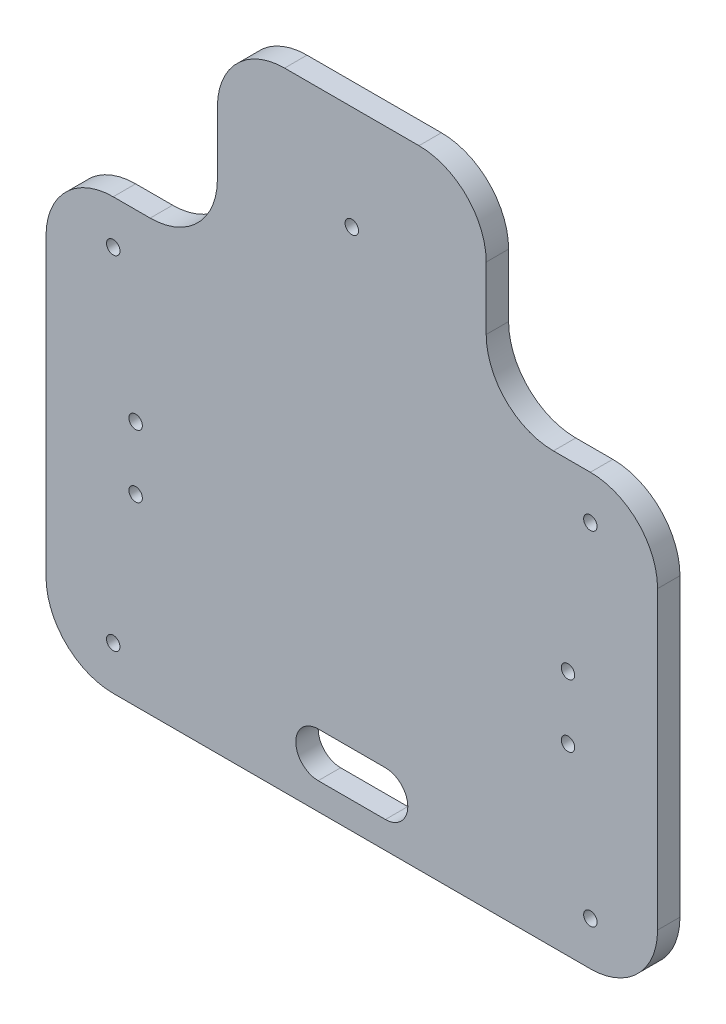
ISO-10303-21;
HEADER;
FILE_DESCRIPTION(('STEP AP214'),'2;1');
FILE_NAME('part.step','',(''),(''),'','','');
FILE_SCHEMA(('AUTOMOTIVE_DESIGN { 1 0 10303 214 1 1 1 1 }'));
ENDSEC;
DATA;
#1=APPLICATION_CONTEXT('core data for automotive mechanical design processes');
#2=APPLICATION_PROTOCOL_DEFINITION('international standard','automotive_design',2000,#1);
#3=PRODUCT_CONTEXT('',#1,'mechanical');
#4=PRODUCT('Part','Part','',(#3));
#5=PRODUCT_RELATED_PRODUCT_CATEGORY('part','',(#4));
#6=PRODUCT_DEFINITION_FORMATION('','',#4);
#7=PRODUCT_DEFINITION_CONTEXT('part definition',#1,'design');
#8=PRODUCT_DEFINITION('design','',#6,#7);
#9=PRODUCT_DEFINITION_SHAPE('','',#8);
#10=(LENGTH_UNIT() NAMED_UNIT(*) SI_UNIT(.MILLI.,.METRE.));
#11=(NAMED_UNIT(*) PLANE_ANGLE_UNIT() SI_UNIT($,.RADIAN.));
#12=(NAMED_UNIT(*) SI_UNIT($,.STERADIAN.) SOLID_ANGLE_UNIT());
#13=UNCERTAINTY_MEASURE_WITH_UNIT(LENGTH_MEASURE(1.E-05),#10,'distance_accuracy_value','');
#14=(GEOMETRIC_REPRESENTATION_CONTEXT(3) GLOBAL_UNCERTAINTY_ASSIGNED_CONTEXT((#13)) GLOBAL_UNIT_ASSIGNED_CONTEXT((#10,
#11,#12)) REPRESENTATION_CONTEXT('',''));
#15=CARTESIAN_POINT('',(0.,0.,0.));
#16=DIRECTION('',(0.,0.,1.));
#17=DIRECTION('',(1.,0.,0.));
#18=AXIS2_PLACEMENT_3D('',#15,#16,#17);
#19=CARTESIAN_POINT('',(822.94463685082,1128.14314030027,5.));
#20=DIRECTION('',(0.,0.,1.));
#21=DIRECTION('',(1.,0.,0.));
#22=AXIS2_PLACEMENT_3D('',#19,#20,#21);
#23=PLANE('',#22);
#24=CARTESIAN_POINT('',(891.19463685082,1089.39314030027,5.));
#25=DIRECTION('',(0.,0.,1.));
#26=DIRECTION('',(1.,0.,0.));
#27=AXIS2_PLACEMENT_3D('',#24,#25,#26);
#28=CIRCLE('',#27,1.50000000000011);
#29=CARTESIAN_POINT('',(892.69463685082,1089.39314030027,5.));
#30=VERTEX_POINT('',#29);
#31=EDGE_CURVE('E747',#30,#30,#28,.T.);
#32=ORIENTED_EDGE('',*,*,#31,.F.);
#33=EDGE_LOOP('',(#32));
#34=FACE_BOUND('',#33,.T.);
#35=CARTESIAN_POINT('',(789.69463685082,1058.14314030027,5.));
#36=DIRECTION('',(0.,0.,1.));
#37=DIRECTION('',(1.,0.,0.));
#38=AXIS2_PLACEMENT_3D('',#35,#36,#37);
#39=CIRCLE('',#38,1.50000000000011);
#40=CARTESIAN_POINT('',(791.19463685082,1058.14314030027,5.));
#41=VERTEX_POINT('',#40);
#42=EDGE_CURVE('E763',#41,#41,#39,.T.);
#43=ORIENTED_EDGE('',*,*,#42,.F.);
#44=EDGE_LOOP('',(#43));
#45=FACE_BOUND('',#44,.T.);
#46=CARTESIAN_POINT('',(886.19463685082,1058.14314030027,5.));
#47=DIRECTION('',(0.,0.,1.));
#48=DIRECTION('',(1.,0.,0.));
#49=AXIS2_PLACEMENT_3D('',#46,#47,#48);
#50=CIRCLE('',#49,1.50000000000011);
#51=CARTESIAN_POINT('',(887.69463685082,1058.14314030027,5.));
#52=VERTEX_POINT('',#51);
#53=EDGE_CURVE('E779',#52,#52,#50,.T.);
#54=ORIENTED_EDGE('',*,*,#53,.F.);
#55=EDGE_LOOP('',(#54));
#56=FACE_BOUND('',#55,.T.);
#57=CARTESIAN_POINT('',(784.69463685082,1012.89314030027,5.));
#58=DIRECTION('',(0.,0.,1.));
#59=DIRECTION('',(1.,0.,0.));
#60=AXIS2_PLACEMENT_3D('',#57,#58,#59);
#61=CIRCLE('',#60,1.50000000000011);
#62=CARTESIAN_POINT('',(786.19463685082,1012.89314030027,5.));
#63=VERTEX_POINT('',#62);
#64=EDGE_CURVE('E795',#63,#63,#61,.T.);
#65=ORIENTED_EDGE('',*,*,#64,.F.);
#66=EDGE_LOOP('',(#65));
#67=FACE_BOUND('',#66,.T.);
#68=DIRECTION('',(-1.,0.,0.));
#69=VECTOR('',#68,1.);
#70=CARTESIAN_POINT('',(845.44463685082,1019.14314030027,5.));
#71=LINE('',#70,#69);
#72=CARTESIAN_POINT('',(845.44463685082,1019.14314030027,5.));
#73=VERTEX_POINT('',#72);
#74=CARTESIAN_POINT('',(830.44463685082,1019.14314030027,5.));
#75=VERTEX_POINT('',#74);
#76=EDGE_CURVE('E186',#73,#75,#71,.T.);
#77=ORIENTED_EDGE('',*,*,#76,.F.);
#78=CARTESIAN_POINT('',(845.44463685082,1014.14314030027,5.));
#79=DIRECTION('',(0.,0.,1.));
#80=DIRECTION('',(1.,0.,0.));
#81=AXIS2_PLACEMENT_3D('',#78,#79,#80);
#82=CIRCLE('',#81,5.00000000000012);
#83=CARTESIAN_POINT('',(845.44463685082,1009.14314030027,5.));
#84=VERTEX_POINT('',#83);
#85=EDGE_CURVE('E177',#84,#73,#82,.T.);
#86=ORIENTED_EDGE('',*,*,#85,.F.);
#87=DIRECTION('',(1.,0.,0.));
#88=VECTOR('',#87,1.);
#89=CARTESIAN_POINT('',(845.44463685082,1009.14314030027,5.));
#90=LINE('',#89,#88);
#91=CARTESIAN_POINT('',(830.44463685082,1009.14314030027,5.));
#92=VERTEX_POINT('',#91);
#93=EDGE_CURVE('E204',#92,#84,#90,.T.);
#94=ORIENTED_EDGE('',*,*,#93,.F.);
#95=CARTESIAN_POINT('',(830.44463685082,1014.14314030027,5.));
#96=DIRECTION('',(0.,0.,1.));
#97=DIRECTION('',(1.,0.,0.));
#98=AXIS2_PLACEMENT_3D('',#95,#96,#97);
#99=CIRCLE('',#98,5.00000000000012);
#100=EDGE_CURVE('E200',#75,#92,#99,.T.);
#101=ORIENTED_EDGE('',*,*,#100,.F.);
#102=EDGE_LOOP('',(#77,#86,#94,#101));
#103=FACE_BOUND('',#102,.T.);
#104=CARTESIAN_POINT('',(822.94463685082,1128.14314030027,5.));
#105=DIRECTION('',(0.,0.,1.));
#106=DIRECTION('',(1.,0.,0.));
#107=AXIS2_PLACEMENT_3D('',#104,#105,#106);
#108=CIRCLE('',#107,15.0000000000001);
#109=CARTESIAN_POINT('',(822.94463685082,1143.14314030027,5.));
#110=VERTEX_POINT('',#109);
#111=CARTESIAN_POINT('',(807.94463685082,1128.14314030027,5.));
#112=VERTEX_POINT('',#111);
#113=EDGE_CURVE('E228',#110,#112,#108,.T.);
#114=ORIENTED_EDGE('',*,*,#113,.T.);
#115=DIRECTION('',(0.,-1.,0.));
#116=VECTOR('',#115,1.);
#117=CARTESIAN_POINT('',(807.94463685082,1128.14314030027,5.));
#118=LINE('',#117,#116);
#119=CARTESIAN_POINT('',(807.94463685082,1114.14314030027,5.));
#120=VERTEX_POINT('',#119);
#121=EDGE_CURVE('E232',#112,#120,#118,.T.);
#122=ORIENTED_EDGE('',*,*,#121,.T.);
#123=CARTESIAN_POINT('',(792.94463685082,1114.14314030027,5.));
#124=DIRECTION('',(0.,0.,-1.));
#125=DIRECTION('',(1.,0.,0.));
#126=AXIS2_PLACEMENT_3D('',#123,#124,#125);
#127=CIRCLE('',#126,15.0000000000003);
#128=CARTESIAN_POINT('',(792.94463685082,1099.14314030027,5.));
#129=VERTEX_POINT('',#128);
#130=EDGE_CURVE('E236',#120,#129,#127,.T.);
#131=ORIENTED_EDGE('',*,*,#130,.T.);
#132=DIRECTION('',(-1.,0.,0.));
#133=VECTOR('',#132,1.);
#134=CARTESIAN_POINT('',(784.69463685082,1099.14314030027,5.));
#135=LINE('',#134,#133);
#136=CARTESIAN_POINT('',(784.69463685082,1099.14314030027,5.));
#137=VERTEX_POINT('',#136);
#138=EDGE_CURVE('E239',#129,#137,#135,.T.);
#139=ORIENTED_EDGE('',*,*,#138,.T.);
#140=CARTESIAN_POINT('',(784.69463685082,1084.14314030027,5.));
#141=DIRECTION('',(0.,0.,1.));
#142=DIRECTION('',(1.,0.,0.));
#143=AXIS2_PLACEMENT_3D('',#140,#141,#142);
#144=CIRCLE('',#143,15.0000000000003);
#145=CARTESIAN_POINT('',(769.69463685082,1084.14314030027,5.));
#146=VERTEX_POINT('',#145);
#147=EDGE_CURVE('E242',#137,#146,#144,.T.);
#148=ORIENTED_EDGE('',*,*,#147,.T.);
#149=DIRECTION('',(0.,-1.,0.));
#150=VECTOR('',#149,1.);
#151=CARTESIAN_POINT('',(769.69463685082,1084.14314030027,5.));
#152=LINE('',#151,#150);
#153=CARTESIAN_POINT('',(769.69463685082,1018.14314030027,5.));
#154=VERTEX_POINT('',#153);
#155=EDGE_CURVE('E245',#146,#154,#152,.T.);
#156=ORIENTED_EDGE('',*,*,#155,.T.);
#157=CARTESIAN_POINT('',(784.69463685082,1018.14314030027,5.));
#158=DIRECTION('',(0.,0.,1.));
#159=DIRECTION('',(1.,0.,0.));
#160=AXIS2_PLACEMENT_3D('',#157,#158,#159);
#161=CIRCLE('',#160,15.0000000000002);
#162=CARTESIAN_POINT('',(784.69463685082,1003.14314030027,5.));
#163=VERTEX_POINT('',#162);
#164=EDGE_CURVE('E248',#154,#163,#161,.T.);
#165=ORIENTED_EDGE('',*,*,#164,.T.);
#166=DIRECTION('',(1.,0.,0.));
#167=VECTOR('',#166,1.);
#168=CARTESIAN_POINT('',(891.19463685082,1003.14314030027,5.));
#169=LINE('',#168,#167);
#170=CARTESIAN_POINT('',(891.19463685082,1003.14314030027,5.));
#171=VERTEX_POINT('',#170);
#172=EDGE_CURVE('E251',#163,#171,#169,.T.);
#173=ORIENTED_EDGE('',*,*,#172,.T.);
#174=CARTESIAN_POINT('',(891.19463685082,1018.14314030027,5.));
#175=DIRECTION('',(0.,0.,1.));
#176=DIRECTION('',(1.,0.,0.));
#177=AXIS2_PLACEMENT_3D('',#174,#175,#176);
#178=CIRCLE('',#177,15.0000000000003);
#179=CARTESIAN_POINT('',(906.19463685082,1018.14314030027,5.));
#180=VERTEX_POINT('',#179);
#181=EDGE_CURVE('E254',#171,#180,#178,.T.);
#182=ORIENTED_EDGE('',*,*,#181,.T.);
#183=DIRECTION('',(0.,1.,0.));
#184=VECTOR('',#183,1.);
#185=CARTESIAN_POINT('',(906.19463685082,1084.14314030027,5.));
#186=LINE('',#185,#184);
#187=CARTESIAN_POINT('',(906.19463685082,1084.14314030027,5.));
#188=VERTEX_POINT('',#187);
#189=EDGE_CURVE('E257',#180,#188,#186,.T.);
#190=ORIENTED_EDGE('',*,*,#189,.T.);
#191=CARTESIAN_POINT('',(891.19463685082,1084.14314030027,5.));
#192=DIRECTION('',(0.,0.,1.));
#193=DIRECTION('',(1.,0.,0.));
#194=AXIS2_PLACEMENT_3D('',#191,#192,#193);
#195=CIRCLE('',#194,15.0000000000003);
#196=CARTESIAN_POINT('',(891.19463685082,1099.14314030027,5.));
#197=VERTEX_POINT('',#196);
#198=EDGE_CURVE('E260',#188,#197,#195,.T.);
#199=ORIENTED_EDGE('',*,*,#198,.T.);
#200=DIRECTION('',(-1.,0.,0.));
#201=VECTOR('',#200,1.);
#202=CARTESIAN_POINT('',(891.19463685082,1099.14314030027,5.));
#203=LINE('',#202,#201);
#204=CARTESIAN_POINT('',(882.94463685082,1099.14314030027,5.));
#205=VERTEX_POINT('',#204);
#206=EDGE_CURVE('E263',#197,#205,#203,.T.);
#207=ORIENTED_EDGE('',*,*,#206,.T.);
#208=CARTESIAN_POINT('',(882.94463685082,1114.14314030027,5.));
#209=DIRECTION('',(0.,0.,-1.));
#210=DIRECTION('',(1.,0.,0.));
#211=AXIS2_PLACEMENT_3D('',#208,#209,#210);
#212=CIRCLE('',#211,15.0000000000001);
#213=CARTESIAN_POINT('',(867.94463685082,1114.14314030027,5.));
#214=VERTEX_POINT('',#213);
#215=EDGE_CURVE('E266',#205,#214,#212,.T.);
#216=ORIENTED_EDGE('',*,*,#215,.T.);
#217=DIRECTION('',(0.,1.,0.));
#218=VECTOR('',#217,1.);
#219=CARTESIAN_POINT('',(867.94463685082,1128.14314030027,5.));
#220=LINE('',#219,#218);
#221=CARTESIAN_POINT('',(867.94463685082,1128.14314030027,5.));
#222=VERTEX_POINT('',#221);
#223=EDGE_CURVE('E269',#214,#222,#220,.T.);
#224=ORIENTED_EDGE('',*,*,#223,.T.);
#225=CARTESIAN_POINT('',(852.94463685082,1128.14314030027,5.));
#226=DIRECTION('',(0.,0.,1.));
#227=DIRECTION('',(1.,0.,0.));
#228=AXIS2_PLACEMENT_3D('',#225,#226,#227);
#229=CIRCLE('',#228,15.0000000000001);
#230=CARTESIAN_POINT('',(852.94463685082,1143.14314030027,5.));
#231=VERTEX_POINT('',#230);
#232=EDGE_CURVE('E272',#222,#231,#229,.T.);
#233=ORIENTED_EDGE('',*,*,#232,.T.);
#234=DIRECTION('',(-1.,0.,0.));
#235=VECTOR('',#234,1.);
#236=CARTESIAN_POINT('',(822.94463685082,1143.14314030027,5.));
#237=LINE('',#236,#235);
#238=EDGE_CURVE('E275',#231,#110,#237,.T.);
#239=ORIENTED_EDGE('',*,*,#238,.T.);
#240=EDGE_LOOP('',(#114,#122,#131,#139,#148,#156,#165,#173,#182,#190,#199,#207,#216,#224,#233,#239));
#241=FACE_BOUND('',#240,.T.);
#242=CARTESIAN_POINT('',(837.94463685082,1119.9277499911,5.));
#243=DIRECTION('',(0.,0.,1.));
#244=DIRECTION('',(1.,0.,0.));
#245=AXIS2_PLACEMENT_3D('',#242,#243,#244);
#246=CIRCLE('',#245,1.50000000000011);
#247=CARTESIAN_POINT('',(839.44463685082,1119.9277499911,5.));
#248=VERTEX_POINT('',#247);
#249=EDGE_CURVE('E212',#248,#248,#246,.T.);
#250=ORIENTED_EDGE('',*,*,#249,.F.);
#251=EDGE_LOOP('',(#250));
#252=FACE_BOUND('',#251,.T.);
#253=CARTESIAN_POINT('',(886.19463685082,1044.14314030027,5.));
#254=DIRECTION('',(0.,0.,1.));
#255=DIRECTION('',(1.,0.,0.));
#256=AXIS2_PLACEMENT_3D('',#253,#254,#255);
#257=CIRCLE('',#256,1.50000000000011);
#258=CARTESIAN_POINT('',(887.69463685082,1044.14314030027,5.));
#259=VERTEX_POINT('',#258);
#260=EDGE_CURVE('E787',#259,#259,#257,.T.);
#261=ORIENTED_EDGE('',*,*,#260,.F.);
#262=EDGE_LOOP('',(#261));
#263=FACE_BOUND('',#262,.T.);
#264=CARTESIAN_POINT('',(789.69463685082,1044.14314030027,5.));
#265=DIRECTION('',(0.,0.,1.));
#266=DIRECTION('',(1.,0.,0.));
#267=AXIS2_PLACEMENT_3D('',#264,#265,#266);
#268=CIRCLE('',#267,1.50000000000011);
#269=CARTESIAN_POINT('',(791.19463685082,1044.14314030027,5.));
#270=VERTEX_POINT('',#269);
#271=EDGE_CURVE('E771',#270,#270,#268,.T.);
#272=ORIENTED_EDGE('',*,*,#271,.F.);
#273=EDGE_LOOP('',(#272));
#274=FACE_BOUND('',#273,.T.);
#275=CARTESIAN_POINT('',(784.69463685082,1089.39314030027,5.));
#276=DIRECTION('',(0.,0.,1.));
#277=DIRECTION('',(1.,0.,0.));
#278=AXIS2_PLACEMENT_3D('',#275,#276,#277);
#279=CIRCLE('',#278,1.50000000000011);
#280=CARTESIAN_POINT('',(786.19463685082,1089.39314030027,5.));
#281=VERTEX_POINT('',#280);
#282=EDGE_CURVE('E755',#281,#281,#279,.T.);
#283=ORIENTED_EDGE('',*,*,#282,.F.);
#284=EDGE_LOOP('',(#283));
#285=FACE_BOUND('',#284,.T.);
#286=CARTESIAN_POINT('',(891.19463685082,1012.89314030027,5.));
#287=DIRECTION('',(0.,0.,1.));
#288=DIRECTION('',(1.,0.,0.));
#289=AXIS2_PLACEMENT_3D('',#286,#287,#288);
#290=CIRCLE('',#289,1.50000000000011);
#291=CARTESIAN_POINT('',(892.69463685082,1012.89314030027,5.));
#292=VERTEX_POINT('',#291);
#293=EDGE_CURVE('E736',#292,#292,#290,.T.);
#294=ORIENTED_EDGE('',*,*,#293,.F.);
#295=EDGE_LOOP('',(#294));
#296=FACE_BOUND('',#295,.T.);
#297=ADVANCED_FACE('F39',(#34,#45,#56,#67,#103,#241,#252,#263,#274,#285,#296),#23,.T.);
#298=CARTESIAN_POINT('',(822.94463685082,1128.14314030027,0.));
#299=DIRECTION('',(0.,0.,1.));
#300=DIRECTION('',(1.,0.,0.));
#301=AXIS2_PLACEMENT_3D('',#298,#299,#300);
#302=PLANE('',#301);
#303=CARTESIAN_POINT('',(822.94463685082,1128.14314030027,0.));
#304=DIRECTION('',(0.,0.,1.));
#305=DIRECTION('',(1.,0.,0.));
#306=AXIS2_PLACEMENT_3D('',#303,#304,#305);
#307=CIRCLE('',#306,15.0000000000001);
#308=CARTESIAN_POINT('',(822.94463685082,1143.14314030027,0.));
#309=VERTEX_POINT('',#308);
#310=CARTESIAN_POINT('',(807.94463685082,1128.14314030027,0.));
#311=VERTEX_POINT('',#310);
#312=EDGE_CURVE('E195',#309,#311,#307,.T.);
#313=ORIENTED_EDGE('',*,*,#312,.F.);
#314=DIRECTION('',(-1.,0.,0.));
#315=VECTOR('',#314,1.);
#316=CARTESIAN_POINT('',(822.94463685082,1143.14314030027,0.));
#317=LINE('',#316,#315);
#318=CARTESIAN_POINT('',(852.94463685082,1143.14314030027,0.));
#319=VERTEX_POINT('',#318);
#320=EDGE_CURVE('E233',#319,#309,#317,.T.);
#321=ORIENTED_EDGE('',*,*,#320,.F.);
#322=CARTESIAN_POINT('',(852.94463685082,1128.14314030027,0.));
#323=DIRECTION('',(0.,0.,1.));
#324=DIRECTION('',(1.,0.,0.));
#325=AXIS2_PLACEMENT_3D('',#322,#323,#324);
#326=CIRCLE('',#325,15.0000000000001);
#327=CARTESIAN_POINT('',(867.94463685082,1128.14314030027,0.));
#328=VERTEX_POINT('',#327);
#329=EDGE_CURVE('E321',#328,#319,#326,.T.);
#330=ORIENTED_EDGE('',*,*,#329,.F.);
#331=DIRECTION('',(0.,1.,0.));
#332=VECTOR('',#331,1.);
#333=CARTESIAN_POINT('',(867.94463685082,1128.14314030027,0.));
#334=LINE('',#333,#332);
#335=CARTESIAN_POINT('',(867.94463685082,1114.14314030027,0.));
#336=VERTEX_POINT('',#335);
#337=EDGE_CURVE('E318',#336,#328,#334,.T.);
#338=ORIENTED_EDGE('',*,*,#337,.F.);
#339=CARTESIAN_POINT('',(882.94463685082,1114.14314030027,0.));
#340=DIRECTION('',(0.,0.,-1.));
#341=DIRECTION('',(1.,0.,0.));
#342=AXIS2_PLACEMENT_3D('',#339,#340,#341);
#343=CIRCLE('',#342,15.0000000000001);
#344=CARTESIAN_POINT('',(882.94463685082,1099.14314030027,0.));
#345=VERTEX_POINT('',#344);
#346=EDGE_CURVE('E315',#345,#336,#343,.T.);
#347=ORIENTED_EDGE('',*,*,#346,.F.);
#348=DIRECTION('',(-1.,0.,0.));
#349=VECTOR('',#348,1.);
#350=CARTESIAN_POINT('',(891.19463685082,1099.14314030027,0.));
#351=LINE('',#350,#349);
#352=CARTESIAN_POINT('',(891.19463685082,1099.14314030027,0.));
#353=VERTEX_POINT('',#352);
#354=EDGE_CURVE('E312',#353,#345,#351,.T.);
#355=ORIENTED_EDGE('',*,*,#354,.F.);
#356=CARTESIAN_POINT('',(891.19463685082,1084.14314030027,0.));
#357=DIRECTION('',(0.,0.,1.));
#358=DIRECTION('',(1.,0.,0.));
#359=AXIS2_PLACEMENT_3D('',#356,#357,#358);
#360=CIRCLE('',#359,15.0000000000003);
#361=CARTESIAN_POINT('',(906.19463685082,1084.14314030027,0.));
#362=VERTEX_POINT('',#361);
#363=EDGE_CURVE('E309',#362,#353,#360,.T.);
#364=ORIENTED_EDGE('',*,*,#363,.F.);
#365=DIRECTION('',(0.,1.,0.));
#366=VECTOR('',#365,1.);
#367=CARTESIAN_POINT('',(906.19463685082,1084.14314030027,0.));
#368=LINE('',#367,#366);
#369=CARTESIAN_POINT('',(906.19463685082,1018.14314030027,0.));
#370=VERTEX_POINT('',#369);
#371=EDGE_CURVE('E306',#370,#362,#368,.T.);
#372=ORIENTED_EDGE('',*,*,#371,.F.);
#373=CARTESIAN_POINT('',(891.19463685082,1018.14314030027,0.));
#374=DIRECTION('',(0.,0.,1.));
#375=DIRECTION('',(1.,0.,0.));
#376=AXIS2_PLACEMENT_3D('',#373,#374,#375);
#377=CIRCLE('',#376,15.0000000000003);
#378=CARTESIAN_POINT('',(891.19463685082,1003.14314030027,0.));
#379=VERTEX_POINT('',#378);
#380=EDGE_CURVE('E303',#379,#370,#377,.T.);
#381=ORIENTED_EDGE('',*,*,#380,.F.);
#382=DIRECTION('',(1.,0.,0.));
#383=VECTOR('',#382,1.);
#384=CARTESIAN_POINT('',(891.19463685082,1003.14314030027,0.));
#385=LINE('',#384,#383);
#386=CARTESIAN_POINT('',(784.69463685082,1003.14314030027,0.));
#387=VERTEX_POINT('',#386);
#388=EDGE_CURVE('E300',#387,#379,#385,.T.);
#389=ORIENTED_EDGE('',*,*,#388,.F.);
#390=CARTESIAN_POINT('',(784.69463685082,1018.14314030027,0.));
#391=DIRECTION('',(0.,0.,1.));
#392=DIRECTION('',(1.,0.,0.));
#393=AXIS2_PLACEMENT_3D('',#390,#391,#392);
#394=CIRCLE('',#393,15.0000000000002);
#395=CARTESIAN_POINT('',(769.69463685082,1018.14314030027,0.));
#396=VERTEX_POINT('',#395);
#397=EDGE_CURVE('E297',#396,#387,#394,.T.);
#398=ORIENTED_EDGE('',*,*,#397,.F.);
#399=DIRECTION('',(0.,-1.,0.));
#400=VECTOR('',#399,1.);
#401=CARTESIAN_POINT('',(769.69463685082,1084.14314030027,0.));
#402=LINE('',#401,#400);
#403=CARTESIAN_POINT('',(769.69463685082,1084.14314030027,0.));
#404=VERTEX_POINT('',#403);
#405=EDGE_CURVE('E294',#404,#396,#402,.T.);
#406=ORIENTED_EDGE('',*,*,#405,.F.);
#407=CARTESIAN_POINT('',(784.69463685082,1084.14314030027,0.));
#408=DIRECTION('',(0.,0.,1.));
#409=DIRECTION('',(1.,0.,0.));
#410=AXIS2_PLACEMENT_3D('',#407,#408,#409);
#411=CIRCLE('',#410,15.0000000000003);
#412=CARTESIAN_POINT('',(784.69463685082,1099.14314030027,0.));
#413=VERTEX_POINT('',#412);
#414=EDGE_CURVE('E291',#413,#404,#411,.T.);
#415=ORIENTED_EDGE('',*,*,#414,.F.);
#416=DIRECTION('',(-1.,0.,0.));
#417=VECTOR('',#416,1.);
#418=CARTESIAN_POINT('',(784.69463685082,1099.14314030027,0.));
#419=LINE('',#418,#417);
#420=CARTESIAN_POINT('',(792.94463685082,1099.14314030027,0.));
#421=VERTEX_POINT('',#420);
#422=EDGE_CURVE('E288',#421,#413,#419,.T.);
#423=ORIENTED_EDGE('',*,*,#422,.F.);
#424=CARTESIAN_POINT('',(792.94463685082,1114.14314030027,0.));
#425=DIRECTION('',(0.,0.,-1.));
#426=DIRECTION('',(1.,0.,0.));
#427=AXIS2_PLACEMENT_3D('',#424,#425,#426);
#428=CIRCLE('',#427,15.0000000000003);
#429=CARTESIAN_POINT('',(807.94463685082,1114.14314030027,0.));
#430=VERTEX_POINT('',#429);
#431=EDGE_CURVE('E285',#430,#421,#428,.T.);
#432=ORIENTED_EDGE('',*,*,#431,.F.);
#433=DIRECTION('',(0.,-1.,0.));
#434=VECTOR('',#433,1.);
#435=CARTESIAN_POINT('',(807.94463685082,1128.14314030027,0.));
#436=LINE('',#435,#434);
#437=EDGE_CURVE('E282',#311,#430,#436,.T.);
#438=ORIENTED_EDGE('',*,*,#437,.F.);
#439=EDGE_LOOP('',(#313,#321,#330,#338,#347,#355,#364,#372,#381,#389,#398,#406,#415,#423,#432,#438));
#440=FACE_BOUND('',#439,.T.);
#441=CARTESIAN_POINT('',(845.44463685082,1014.14314030027,0.));
#442=DIRECTION('',(0.,0.,1.));
#443=DIRECTION('',(1.,0.,0.));
#444=AXIS2_PLACEMENT_3D('',#441,#442,#443);
#445=CIRCLE('',#444,5.00000000000012);
#446=CARTESIAN_POINT('',(845.44463685082,1009.14314030027,0.));
#447=VERTEX_POINT('',#446);
#448=CARTESIAN_POINT('',(845.44463685082,1019.14314030027,0.));
#449=VERTEX_POINT('',#448);
#450=EDGE_CURVE('E63',#447,#449,#445,.T.);
#451=ORIENTED_EDGE('',*,*,#450,.T.);
#452=DIRECTION('',(-1.,0.,0.));
#453=VECTOR('',#452,1.);
#454=CARTESIAN_POINT('',(845.44463685082,1019.14314030027,0.));
#455=LINE('',#454,#453);
#456=CARTESIAN_POINT('',(830.44463685082,1019.14314030027,0.));
#457=VERTEX_POINT('',#456);
#458=EDGE_CURVE('E193',#449,#457,#455,.T.);
#459=ORIENTED_EDGE('',*,*,#458,.T.);
#460=CARTESIAN_POINT('',(830.44463685082,1014.14314030027,0.));
#461=DIRECTION('',(0.,0.,1.));
#462=DIRECTION('',(1.,0.,0.));
#463=AXIS2_PLACEMENT_3D('',#460,#461,#462);
#464=CIRCLE('',#463,5.00000000000012);
#465=CARTESIAN_POINT('',(830.44463685082,1009.14314030027,0.));
#466=VERTEX_POINT('',#465);
#467=EDGE_CURVE('E215',#457,#466,#464,.T.);
#468=ORIENTED_EDGE('',*,*,#467,.T.);
#469=DIRECTION('',(1.,0.,0.));
#470=VECTOR('',#469,1.);
#471=CARTESIAN_POINT('',(845.44463685082,1009.14314030027,0.));
#472=LINE('',#471,#470);
#473=EDGE_CURVE('E187',#466,#447,#472,.T.);
#474=ORIENTED_EDGE('',*,*,#473,.T.);
#475=EDGE_LOOP('',(#451,#459,#468,#474));
#476=FACE_BOUND('',#475,.T.);
#477=CARTESIAN_POINT('',(837.94463685082,1119.9277499911,0.));
#478=DIRECTION('',(0.,0.,1.));
#479=DIRECTION('',(1.,0.,0.));
#480=AXIS2_PLACEMENT_3D('',#477,#478,#479);
#481=CIRCLE('',#480,1.50000000000011);
#482=CARTESIAN_POINT('',(839.44463685082,1119.9277499911,0.));
#483=VERTEX_POINT('',#482);
#484=EDGE_CURVE('E799',#483,#483,#481,.T.);
#485=ORIENTED_EDGE('',*,*,#484,.T.);
#486=EDGE_LOOP('',(#485));
#487=FACE_BOUND('',#486,.T.);
#488=CARTESIAN_POINT('',(784.69463685082,1012.89314030027,0.));
#489=DIRECTION('',(0.,0.,1.));
#490=DIRECTION('',(1.,0.,0.));
#491=AXIS2_PLACEMENT_3D('',#488,#489,#490);
#492=CIRCLE('',#491,1.50000000000011);
#493=CARTESIAN_POINT('',(786.19463685082,1012.89314030027,0.));
#494=VERTEX_POINT('',#493);
#495=EDGE_CURVE('E791',#494,#494,#492,.T.);
#496=ORIENTED_EDGE('',*,*,#495,.T.);
#497=EDGE_LOOP('',(#496));
#498=FACE_BOUND('',#497,.T.);
#499=CARTESIAN_POINT('',(886.19463685082,1044.14314030027,0.));
#500=DIRECTION('',(0.,0.,1.));
#501=DIRECTION('',(1.,0.,0.));
#502=AXIS2_PLACEMENT_3D('',#499,#500,#501);
#503=CIRCLE('',#502,1.50000000000011);
#504=CARTESIAN_POINT('',(887.69463685082,1044.14314030027,0.));
#505=VERTEX_POINT('',#504);
#506=EDGE_CURVE('E783',#505,#505,#503,.T.);
#507=ORIENTED_EDGE('',*,*,#506,.T.);
#508=EDGE_LOOP('',(#507));
#509=FACE_BOUND('',#508,.T.);
#510=CARTESIAN_POINT('',(886.19463685082,1058.14314030027,0.));
#511=DIRECTION('',(0.,0.,1.));
#512=DIRECTION('',(1.,0.,0.));
#513=AXIS2_PLACEMENT_3D('',#510,#511,#512);
#514=CIRCLE('',#513,1.50000000000011);
#515=CARTESIAN_POINT('',(887.69463685082,1058.14314030027,0.));
#516=VERTEX_POINT('',#515);
#517=EDGE_CURVE('E775',#516,#516,#514,.T.);
#518=ORIENTED_EDGE('',*,*,#517,.T.);
#519=EDGE_LOOP('',(#518));
#520=FACE_BOUND('',#519,.T.);
#521=CARTESIAN_POINT('',(789.69463685082,1044.14314030027,0.));
#522=DIRECTION('',(0.,0.,1.));
#523=DIRECTION('',(1.,0.,0.));
#524=AXIS2_PLACEMENT_3D('',#521,#522,#523);
#525=CIRCLE('',#524,1.50000000000011);
#526=CARTESIAN_POINT('',(791.19463685082,1044.14314030027,0.));
#527=VERTEX_POINT('',#526);
#528=EDGE_CURVE('E767',#527,#527,#525,.T.);
#529=ORIENTED_EDGE('',*,*,#528,.T.);
#530=EDGE_LOOP('',(#529));
#531=FACE_BOUND('',#530,.T.);
#532=CARTESIAN_POINT('',(789.69463685082,1058.14314030027,0.));
#533=DIRECTION('',(0.,0.,1.));
#534=DIRECTION('',(1.,0.,0.));
#535=AXIS2_PLACEMENT_3D('',#532,#533,#534);
#536=CIRCLE('',#535,1.50000000000011);
#537=CARTESIAN_POINT('',(791.19463685082,1058.14314030027,0.));
#538=VERTEX_POINT('',#537);
#539=EDGE_CURVE('E759',#538,#538,#536,.T.);
#540=ORIENTED_EDGE('',*,*,#539,.T.);
#541=EDGE_LOOP('',(#540));
#542=FACE_BOUND('',#541,.T.);
#543=CARTESIAN_POINT('',(784.69463685082,1089.39314030027,0.));
#544=DIRECTION('',(0.,0.,1.));
#545=DIRECTION('',(1.,0.,0.));
#546=AXIS2_PLACEMENT_3D('',#543,#544,#545);
#547=CIRCLE('',#546,1.50000000000011);
#548=CARTESIAN_POINT('',(786.19463685082,1089.39314030027,0.));
#549=VERTEX_POINT('',#548);
#550=EDGE_CURVE('E751',#549,#549,#547,.T.);
#551=ORIENTED_EDGE('',*,*,#550,.T.);
#552=EDGE_LOOP('',(#551));
#553=FACE_BOUND('',#552,.T.);
#554=CARTESIAN_POINT('',(891.19463685082,1089.39314030027,0.));
#555=DIRECTION('',(0.,0.,1.));
#556=DIRECTION('',(1.,0.,0.));
#557=AXIS2_PLACEMENT_3D('',#554,#555,#556);
#558=CIRCLE('',#557,1.50000000000011);
#559=CARTESIAN_POINT('',(892.69463685082,1089.39314030027,0.));
#560=VERTEX_POINT('',#559);
#561=EDGE_CURVE('E744',#560,#560,#558,.T.);
#562=ORIENTED_EDGE('',*,*,#561,.T.);
#563=EDGE_LOOP('',(#562));
#564=FACE_BOUND('',#563,.T.);
#565=CARTESIAN_POINT('',(891.19463685082,1012.89314030027,0.));
#566=DIRECTION('',(0.,0.,1.));
#567=DIRECTION('',(1.,0.,0.));
#568=AXIS2_PLACEMENT_3D('',#565,#566,#567);
#569=CIRCLE('',#568,1.50000000000011);
#570=CARTESIAN_POINT('',(892.69463685082,1012.89314030027,0.));
#571=VERTEX_POINT('',#570);
#572=EDGE_CURVE('E739',#571,#571,#569,.T.);
#573=ORIENTED_EDGE('',*,*,#572,.T.);
#574=EDGE_LOOP('',(#573));
#575=FACE_BOUND('',#574,.T.);
#576=ADVANCED_FACE('F392',(#440,#476,#487,#498,#509,#520,#531,#542,#553,#564,#575),#302,.F.);
#577=CARTESIAN_POINT('',(822.94463685082,1128.14314030027,5.));
#578=DIRECTION('',(0.,0.,-1.));
#579=DIRECTION('',(-1.,0.,0.));
#580=AXIS2_PLACEMENT_3D('',#577,#578,#579);
#581=CYLINDRICAL_SURFACE('',#580,15.0000000000001);
#582=ORIENTED_EDGE('',*,*,#312,.T.);
#583=DIRECTION('',(0.,0.,-1.));
#584=VECTOR('',#583,1.);
#585=CARTESIAN_POINT('',(807.94463685082,1128.14314030027,5.));
#586=LINE('',#585,#584);
#587=EDGE_CURVE('E11',#112,#311,#586,.T.);
#588=ORIENTED_EDGE('',*,*,#587,.F.);
#589=ORIENTED_EDGE('',*,*,#113,.F.);
#590=DIRECTION('',(0.,0.,-1.));
#591=VECTOR('',#590,1.);
#592=CARTESIAN_POINT('',(822.94463685082,1143.14314030027,5.));
#593=LINE('',#592,#591);
#594=EDGE_CURVE('E278',#110,#309,#593,.T.);
#595=ORIENTED_EDGE('',*,*,#594,.T.);
#596=EDGE_LOOP('',(#582,#588,#589,#595));
#597=FACE_BOUND('',#596,.T.);
#598=ADVANCED_FACE('F41',(#597),#581,.T.);
#599=CARTESIAN_POINT('',(807.94463685082,1128.14314030027,5.));
#600=DIRECTION('',(1.,0.,0.));
#601=DIRECTION('',(0.,0.,-1.));
#602=AXIS2_PLACEMENT_3D('',#599,#600,#601);
#603=PLANE('',#602);
#604=ORIENTED_EDGE('',*,*,#437,.T.);
#605=DIRECTION('',(0.,0.,-1.));
#606=VECTOR('',#605,1.);
#607=CARTESIAN_POINT('',(807.94463685082,1114.14314030027,5.));
#608=LINE('',#607,#606);
#609=EDGE_CURVE('E48',#120,#430,#608,.T.);
#610=ORIENTED_EDGE('',*,*,#609,.F.);
#611=ORIENTED_EDGE('',*,*,#121,.F.);
#612=ORIENTED_EDGE('',*,*,#587,.T.);
#613=EDGE_LOOP('',(#604,#610,#611,#612));
#614=FACE_BOUND('',#613,.T.);
#615=ADVANCED_FACE('F409',(#614),#603,.F.);
#616=CARTESIAN_POINT('',(792.94463685082,1114.14314030027,5.));
#617=DIRECTION('',(0.,0.,-1.));
#618=DIRECTION('',(-1.,0.,0.));
#619=AXIS2_PLACEMENT_3D('',#616,#617,#618);
#620=CYLINDRICAL_SURFACE('',#619,15.0000000000003);
#621=ORIENTED_EDGE('',*,*,#431,.T.);
#622=DIRECTION('',(0.,0.,-1.));
#623=VECTOR('',#622,1.);
#624=CARTESIAN_POINT('',(792.94463685082,1099.14314030027,5.));
#625=LINE('',#624,#623);
#626=EDGE_CURVE('E377',#129,#421,#625,.T.);
#627=ORIENTED_EDGE('',*,*,#626,.F.);
#628=ORIENTED_EDGE('',*,*,#130,.F.);
#629=ORIENTED_EDGE('',*,*,#609,.T.);
#630=EDGE_LOOP('',(#621,#627,#628,#629));
#631=FACE_BOUND('',#630,.T.);
#632=ADVANCED_FACE('F386',(#631),#620,.F.);
#633=CARTESIAN_POINT('',(784.69463685082,1099.14314030027,5.));
#634=DIRECTION('',(0.,-1.,0.));
#635=DIRECTION('',(0.,0.,-1.));
#636=AXIS2_PLACEMENT_3D('',#633,#634,#635);
#637=PLANE('',#636);
#638=ORIENTED_EDGE('',*,*,#422,.T.);
#639=DIRECTION('',(0.,0.,-1.));
#640=VECTOR('',#639,1.);
#641=CARTESIAN_POINT('',(784.69463685082,1099.14314030027,5.));
#642=LINE('',#641,#640);
#643=EDGE_CURVE('E373',#137,#413,#642,.T.);
#644=ORIENTED_EDGE('',*,*,#643,.F.);
#645=ORIENTED_EDGE('',*,*,#138,.F.);
#646=ORIENTED_EDGE('',*,*,#626,.T.);
#647=EDGE_LOOP('',(#638,#644,#645,#646));
#648=FACE_BOUND('',#647,.T.);
#649=ADVANCED_FACE('F398',(#648),#637,.F.);
#650=CARTESIAN_POINT('',(784.69463685082,1084.14314030027,5.));
#651=DIRECTION('',(0.,0.,-1.));
#652=DIRECTION('',(-1.,0.,0.));
#653=AXIS2_PLACEMENT_3D('',#650,#651,#652);
#654=CYLINDRICAL_SURFACE('',#653,15.0000000000003);
#655=ORIENTED_EDGE('',*,*,#414,.T.);
#656=DIRECTION('',(0.,0.,-1.));
#657=VECTOR('',#656,1.);
#658=CARTESIAN_POINT('',(769.69463685082,1084.14314030027,5.));
#659=LINE('',#658,#657);
#660=EDGE_CURVE('E369',#146,#404,#659,.T.);
#661=ORIENTED_EDGE('',*,*,#660,.F.);
#662=ORIENTED_EDGE('',*,*,#147,.F.);
#663=ORIENTED_EDGE('',*,*,#643,.T.);
#664=EDGE_LOOP('',(#655,#661,#662,#663));
#665=FACE_BOUND('',#664,.T.);
#666=ADVANCED_FACE('F402',(#665),#654,.T.);
#667=CARTESIAN_POINT('',(769.69463685082,1084.14314030027,5.));
#668=DIRECTION('',(1.,0.,0.));
#669=DIRECTION('',(0.,1.,0.));
#670=AXIS2_PLACEMENT_3D('',#667,#668,#669);
#671=PLANE('',#670);
#672=ORIENTED_EDGE('',*,*,#405,.T.);
#673=DIRECTION('',(0.,0.,-1.));
#674=VECTOR('',#673,1.);
#675=CARTESIAN_POINT('',(769.69463685082,1018.14314030027,5.));
#676=LINE('',#675,#674);
#677=EDGE_CURVE('E365',#154,#396,#676,.T.);
#678=ORIENTED_EDGE('',*,*,#677,.F.);
#679=ORIENTED_EDGE('',*,*,#155,.F.);
#680=ORIENTED_EDGE('',*,*,#660,.T.);
#681=EDGE_LOOP('',(#672,#678,#679,#680));
#682=FACE_BOUND('',#681,.T.);
#683=ADVANCED_FACE('F462',(#682),#671,.F.);
#684=CARTESIAN_POINT('',(784.69463685082,1018.14314030027,5.));
#685=DIRECTION('',(0.,0.,-1.));
#686=DIRECTION('',(-1.,0.,0.));
#687=AXIS2_PLACEMENT_3D('',#684,#685,#686);
#688=CYLINDRICAL_SURFACE('',#687,15.0000000000002);
#689=ORIENTED_EDGE('',*,*,#397,.T.);
#690=DIRECTION('',(0.,0.,-1.));
#691=VECTOR('',#690,1.);
#692=CARTESIAN_POINT('',(784.69463685082,1003.14314030027,5.));
#693=LINE('',#692,#691);
#694=EDGE_CURVE('E361',#163,#387,#693,.T.);
#695=ORIENTED_EDGE('',*,*,#694,.F.);
#696=ORIENTED_EDGE('',*,*,#164,.F.);
#697=ORIENTED_EDGE('',*,*,#677,.T.);
#698=EDGE_LOOP('',(#689,#695,#696,#697));
#699=FACE_BOUND('',#698,.T.);
#700=ADVANCED_FACE('F459',(#699),#688,.T.);
#701=CARTESIAN_POINT('',(891.19463685082,1003.14314030027,5.));
#702=DIRECTION('',(0.,1.,0.));
#703=DIRECTION('',(-1.,0.,0.));
#704=AXIS2_PLACEMENT_3D('',#701,#702,#703);
#705=PLANE('',#704);
#706=ORIENTED_EDGE('',*,*,#388,.T.);
#707=DIRECTION('',(0.,0.,-1.));
#708=VECTOR('',#707,1.);
#709=CARTESIAN_POINT('',(891.19463685082,1003.14314030027,5.));
#710=LINE('',#709,#708);
#711=EDGE_CURVE('E357',#171,#379,#710,.T.);
#712=ORIENTED_EDGE('',*,*,#711,.F.);
#713=ORIENTED_EDGE('',*,*,#172,.F.);
#714=ORIENTED_EDGE('',*,*,#694,.T.);
#715=EDGE_LOOP('',(#706,#712,#713,#714));
#716=FACE_BOUND('',#715,.T.);
#717=ADVANCED_FACE('F455',(#716),#705,.F.);
#718=CARTESIAN_POINT('',(891.19463685082,1018.14314030027,5.));
#719=DIRECTION('',(0.,0.,-1.));
#720=DIRECTION('',(-1.,0.,0.));
#721=AXIS2_PLACEMENT_3D('',#718,#719,#720);
#722=CYLINDRICAL_SURFACE('',#721,15.0000000000003);
#723=ORIENTED_EDGE('',*,*,#380,.T.);
#724=DIRECTION('',(0.,0.,-1.));
#725=VECTOR('',#724,1.);
#726=CARTESIAN_POINT('',(906.19463685082,1018.14314030027,5.));
#727=LINE('',#726,#725);
#728=EDGE_CURVE('E353',#180,#370,#727,.T.);
#729=ORIENTED_EDGE('',*,*,#728,.F.);
#730=ORIENTED_EDGE('',*,*,#181,.F.);
#731=ORIENTED_EDGE('',*,*,#711,.T.);
#732=EDGE_LOOP('',(#723,#729,#730,#731));
#733=FACE_BOUND('',#732,.T.);
#734=ADVANCED_FACE('F451',(#733),#722,.T.);
#735=CARTESIAN_POINT('',(906.19463685082,1084.14314030027,5.));
#736=DIRECTION('',(-1.,0.,0.));
#737=DIRECTION('',(0.,-1.,0.));
#738=AXIS2_PLACEMENT_3D('',#735,#736,#737);
#739=PLANE('',#738);
#740=ORIENTED_EDGE('',*,*,#371,.T.);
#741=DIRECTION('',(0.,0.,-1.));
#742=VECTOR('',#741,1.);
#743=CARTESIAN_POINT('',(906.19463685082,1084.14314030027,5.));
#744=LINE('',#743,#742);
#745=EDGE_CURVE('E349',#188,#362,#744,.T.);
#746=ORIENTED_EDGE('',*,*,#745,.F.);
#747=ORIENTED_EDGE('',*,*,#189,.F.);
#748=ORIENTED_EDGE('',*,*,#728,.T.);
#749=EDGE_LOOP('',(#740,#746,#747,#748));
#750=FACE_BOUND('',#749,.T.);
#751=ADVANCED_FACE('F446',(#750),#739,.F.);
#752=CARTESIAN_POINT('',(891.19463685082,1084.14314030027,5.));
#753=DIRECTION('',(0.,0.,-1.));
#754=DIRECTION('',(-1.,0.,0.));
#755=AXIS2_PLACEMENT_3D('',#752,#753,#754);
#756=CYLINDRICAL_SURFACE('',#755,15.0000000000003);
#757=ORIENTED_EDGE('',*,*,#363,.T.);
#758=DIRECTION('',(0.,0.,-1.));
#759=VECTOR('',#758,1.);
#760=CARTESIAN_POINT('',(891.19463685082,1099.14314030027,5.));
#761=LINE('',#760,#759);
#762=EDGE_CURVE('E345',#197,#353,#761,.T.);
#763=ORIENTED_EDGE('',*,*,#762,.F.);
#764=ORIENTED_EDGE('',*,*,#198,.F.);
#765=ORIENTED_EDGE('',*,*,#745,.T.);
#766=EDGE_LOOP('',(#757,#763,#764,#765));
#767=FACE_BOUND('',#766,.T.);
#768=ADVANCED_FACE('F440',(#767),#756,.T.);
#769=CARTESIAN_POINT('',(891.19463685082,1099.14314030027,5.));
#770=DIRECTION('',(0.,-1.,0.));
#771=DIRECTION('',(0.,0.,-1.));
#772=AXIS2_PLACEMENT_3D('',#769,#770,#771);
#773=PLANE('',#772);
#774=ORIENTED_EDGE('',*,*,#354,.T.);
#775=DIRECTION('',(0.,0.,-1.));
#776=VECTOR('',#775,1.);
#777=CARTESIAN_POINT('',(882.94463685082,1099.14314030027,5.));
#778=LINE('',#777,#776);
#779=EDGE_CURVE('E341',#205,#345,#778,.T.);
#780=ORIENTED_EDGE('',*,*,#779,.F.);
#781=ORIENTED_EDGE('',*,*,#206,.F.);
#782=ORIENTED_EDGE('',*,*,#762,.T.);
#783=EDGE_LOOP('',(#774,#780,#781,#782));
#784=FACE_BOUND('',#783,.T.);
#785=ADVANCED_FACE('F436',(#784),#773,.F.);
#786=CARTESIAN_POINT('',(882.94463685082,1114.14314030027,5.));
#787=DIRECTION('',(0.,0.,-1.));
#788=DIRECTION('',(-1.,0.,0.));
#789=AXIS2_PLACEMENT_3D('',#786,#787,#788);
#790=CYLINDRICAL_SURFACE('',#789,15.0000000000001);
#791=ORIENTED_EDGE('',*,*,#346,.T.);
#792=DIRECTION('',(0.,0.,-1.));
#793=VECTOR('',#792,1.);
#794=CARTESIAN_POINT('',(867.94463685082,1114.14314030027,5.));
#795=LINE('',#794,#793);
#796=EDGE_CURVE('E337',#214,#336,#795,.T.);
#797=ORIENTED_EDGE('',*,*,#796,.F.);
#798=ORIENTED_EDGE('',*,*,#215,.F.);
#799=ORIENTED_EDGE('',*,*,#779,.T.);
#800=EDGE_LOOP('',(#791,#797,#798,#799));
#801=FACE_BOUND('',#800,.T.);
#802=ADVANCED_FACE('F431',(#801),#790,.F.);
#803=CARTESIAN_POINT('',(867.94463685082,1128.14314030027,5.));
#804=DIRECTION('',(-1.,0.,0.));
#805=DIRECTION('',(0.,0.,1.));
#806=AXIS2_PLACEMENT_3D('',#803,#804,#805);
#807=PLANE('',#806);
#808=ORIENTED_EDGE('',*,*,#337,.T.);
#809=DIRECTION('',(0.,0.,-1.));
#810=VECTOR('',#809,1.);
#811=CARTESIAN_POINT('',(867.94463685082,1128.14314030027,5.));
#812=LINE('',#811,#810);
#813=EDGE_CURVE('E333',#222,#328,#812,.T.);
#814=ORIENTED_EDGE('',*,*,#813,.F.);
#815=ORIENTED_EDGE('',*,*,#223,.F.);
#816=ORIENTED_EDGE('',*,*,#796,.T.);
#817=EDGE_LOOP('',(#808,#814,#815,#816));
#818=FACE_BOUND('',#817,.T.);
#819=ADVANCED_FACE('F425',(#818),#807,.F.);
#820=CARTESIAN_POINT('',(852.94463685082,1128.14314030027,5.));
#821=DIRECTION('',(0.,0.,-1.));
#822=DIRECTION('',(-1.,0.,0.));
#823=AXIS2_PLACEMENT_3D('',#820,#821,#822);
#824=CYLINDRICAL_SURFACE('',#823,15.0000000000001);
#825=ORIENTED_EDGE('',*,*,#329,.T.);
#826=DIRECTION('',(0.,0.,-1.));
#827=VECTOR('',#826,1.);
#828=CARTESIAN_POINT('',(852.94463685082,1143.14314030027,5.));
#829=LINE('',#828,#827);
#830=EDGE_CURVE('E329',#231,#319,#829,.T.);
#831=ORIENTED_EDGE('',*,*,#830,.F.);
#832=ORIENTED_EDGE('',*,*,#232,.F.);
#833=ORIENTED_EDGE('',*,*,#813,.T.);
#834=EDGE_LOOP('',(#825,#831,#832,#833));
#835=FACE_BOUND('',#834,.T.);
#836=ADVANCED_FACE('F421',(#835),#824,.T.);
#837=CARTESIAN_POINT('',(822.94463685082,1143.14314030027,5.));
#838=DIRECTION('',(0.,-1.,0.));
#839=DIRECTION('',(0.,0.,-1.));
#840=AXIS2_PLACEMENT_3D('',#837,#838,#839);
#841=PLANE('',#840);
#842=ORIENTED_EDGE('',*,*,#320,.T.);
#843=ORIENTED_EDGE('',*,*,#594,.F.);
#844=ORIENTED_EDGE('',*,*,#238,.F.);
#845=ORIENTED_EDGE('',*,*,#830,.T.);
#846=EDGE_LOOP('',(#842,#843,#844,#845));
#847=FACE_BOUND('',#846,.T.);
#848=ADVANCED_FACE('F416',(#847),#841,.F.);
#849=CARTESIAN_POINT('',(845.44463685082,1014.14314030027,5.));
#850=DIRECTION('',(0.,0.,-1.));
#851=DIRECTION('',(-1.,0.,0.));
#852=AXIS2_PLACEMENT_3D('',#849,#850,#851);
#853=CYLINDRICAL_SURFACE('',#852,5.00000000000012);
#854=ORIENTED_EDGE('',*,*,#450,.F.);
#855=DIRECTION('',(0.,0.,-1.));
#856=VECTOR('',#855,1.);
#857=CARTESIAN_POINT('',(845.44463685082,1009.14314030027,5.));
#858=LINE('',#857,#856);
#859=EDGE_CURVE('E181',#84,#447,#858,.T.);
#860=ORIENTED_EDGE('',*,*,#859,.F.);
#861=ORIENTED_EDGE('',*,*,#85,.T.);
#862=DIRECTION('',(0.,0.,-1.));
#863=VECTOR('',#862,1.);
#864=CARTESIAN_POINT('',(845.44463685082,1019.14314030027,5.));
#865=LINE('',#864,#863);
#866=EDGE_CURVE('E180',#73,#449,#865,.T.);
#867=ORIENTED_EDGE('',*,*,#866,.T.);
#868=EDGE_LOOP('',(#854,#860,#861,#867));
#869=FACE_BOUND('',#868,.T.);
#870=ADVANCED_FACE('F179',(#869),#853,.F.);
#871=CARTESIAN_POINT('',(845.44463685082,1019.14314030027,5.));
#872=DIRECTION('',(0.,-1.,0.));
#873=DIRECTION('',(0.,0.,-1.));
#874=AXIS2_PLACEMENT_3D('',#871,#872,#873);
#875=PLANE('',#874);
#876=ORIENTED_EDGE('',*,*,#458,.F.);
#877=ORIENTED_EDGE('',*,*,#866,.F.);
#878=ORIENTED_EDGE('',*,*,#76,.T.);
#879=DIRECTION('',(0.,0.,-1.));
#880=VECTOR('',#879,1.);
#881=CARTESIAN_POINT('',(830.44463685082,1019.14314030027,5.));
#882=LINE('',#881,#880);
#883=EDGE_CURVE('E196',#75,#457,#882,.T.);
#884=ORIENTED_EDGE('',*,*,#883,.T.);
#885=EDGE_LOOP('',(#876,#877,#878,#884));
#886=FACE_BOUND('',#885,.T.);
#887=ADVANCED_FACE('F190',(#886),#875,.T.);
#888=CARTESIAN_POINT('',(830.44463685082,1014.14314030027,5.));
#889=DIRECTION('',(0.,0.,-1.));
#890=DIRECTION('',(-1.,0.,0.));
#891=AXIS2_PLACEMENT_3D('',#888,#889,#890);
#892=CYLINDRICAL_SURFACE('',#891,5.00000000000012);
#893=ORIENTED_EDGE('',*,*,#467,.F.);
#894=ORIENTED_EDGE('',*,*,#883,.F.);
#895=ORIENTED_EDGE('',*,*,#100,.T.);
#896=DIRECTION('',(0.,0.,-1.));
#897=VECTOR('',#896,1.);
#898=CARTESIAN_POINT('',(830.44463685082,1009.14314030027,5.));
#899=LINE('',#898,#897);
#900=EDGE_CURVE('E55',#92,#466,#899,.T.);
#901=ORIENTED_EDGE('',*,*,#900,.T.);
#902=EDGE_LOOP('',(#893,#894,#895,#901));
#903=FACE_BOUND('',#902,.T.);
#904=ADVANCED_FACE('F547',(#903),#892,.F.);
#905=CARTESIAN_POINT('',(845.44463685082,1009.14314030027,5.));
#906=DIRECTION('',(0.,1.,0.));
#907=DIRECTION('',(0.,0.,1.));
#908=AXIS2_PLACEMENT_3D('',#905,#906,#907);
#909=PLANE('',#908);
#910=ORIENTED_EDGE('',*,*,#473,.F.);
#911=ORIENTED_EDGE('',*,*,#900,.F.);
#912=ORIENTED_EDGE('',*,*,#93,.T.);
#913=ORIENTED_EDGE('',*,*,#859,.T.);
#914=EDGE_LOOP('',(#910,#911,#912,#913));
#915=FACE_BOUND('',#914,.T.);
#916=ADVANCED_FACE('F553',(#915),#909,.T.);
#917=CARTESIAN_POINT('',(837.94463685082,1119.9277499911,5.));
#918=DIRECTION('',(0.,0.,-1.));
#919=DIRECTION('',(-1.,0.,0.));
#920=AXIS2_PLACEMENT_3D('',#917,#918,#919);
#921=CYLINDRICAL_SURFACE('',#920,1.50000000000011);
#922=ORIENTED_EDGE('',*,*,#249,.T.);
#923=EDGE_LOOP('',(#922));
#924=FACE_BOUND('',#923,.T.);
#925=ORIENTED_EDGE('',*,*,#484,.F.);
#926=EDGE_LOOP('',(#925));
#927=FACE_BOUND('',#926,.T.);
#928=ADVANCED_FACE('F561',(#924,#927),#921,.F.);
#929=CARTESIAN_POINT('',(784.69463685082,1012.89314030027,5.));
#930=DIRECTION('',(0.,0.,-1.));
#931=DIRECTION('',(-1.,0.,0.));
#932=AXIS2_PLACEMENT_3D('',#929,#930,#931);
#933=CYLINDRICAL_SURFACE('',#932,1.50000000000011);
#934=ORIENTED_EDGE('',*,*,#64,.T.);
#935=EDGE_LOOP('',(#934));
#936=FACE_BOUND('',#935,.T.);
#937=ORIENTED_EDGE('',*,*,#495,.F.);
#938=EDGE_LOOP('',(#937));
#939=FACE_BOUND('',#938,.T.);
#940=ADVANCED_FACE('F568',(#936,#939),#933,.F.);
#941=CARTESIAN_POINT('',(886.19463685082,1044.14314030027,5.));
#942=DIRECTION('',(0.,0.,-1.));
#943=DIRECTION('',(-1.,0.,0.));
#944=AXIS2_PLACEMENT_3D('',#941,#942,#943);
#945=CYLINDRICAL_SURFACE('',#944,1.50000000000011);
#946=ORIENTED_EDGE('',*,*,#260,.T.);
#947=EDGE_LOOP('',(#946));
#948=FACE_BOUND('',#947,.T.);
#949=ORIENTED_EDGE('',*,*,#506,.F.);
#950=EDGE_LOOP('',(#949));
#951=FACE_BOUND('',#950,.T.);
#952=ADVANCED_FACE('F576',(#948,#951),#945,.F.);
#953=CARTESIAN_POINT('',(886.19463685082,1058.14314030027,5.));
#954=DIRECTION('',(0.,0.,-1.));
#955=DIRECTION('',(-1.,0.,0.));
#956=AXIS2_PLACEMENT_3D('',#953,#954,#955);
#957=CYLINDRICAL_SURFACE('',#956,1.50000000000011);
#958=ORIENTED_EDGE('',*,*,#53,.T.);
#959=EDGE_LOOP('',(#958));
#960=FACE_BOUND('',#959,.T.);
#961=ORIENTED_EDGE('',*,*,#517,.F.);
#962=EDGE_LOOP('',(#961));
#963=FACE_BOUND('',#962,.T.);
#964=ADVANCED_FACE('F584',(#960,#963),#957,.F.);
#965=CARTESIAN_POINT('',(789.69463685082,1044.14314030027,5.));
#966=DIRECTION('',(0.,0.,-1.));
#967=DIRECTION('',(-1.,0.,0.));
#968=AXIS2_PLACEMENT_3D('',#965,#966,#967);
#969=CYLINDRICAL_SURFACE('',#968,1.50000000000011);
#970=ORIENTED_EDGE('',*,*,#271,.T.);
#971=EDGE_LOOP('',(#970));
#972=FACE_BOUND('',#971,.T.);
#973=ORIENTED_EDGE('',*,*,#528,.F.);
#974=EDGE_LOOP('',(#973));
#975=FACE_BOUND('',#974,.T.);
#976=ADVANCED_FACE('F592',(#972,#975),#969,.F.);
#977=CARTESIAN_POINT('',(789.69463685082,1058.14314030027,5.));
#978=DIRECTION('',(0.,0.,-1.));
#979=DIRECTION('',(-1.,0.,0.));
#980=AXIS2_PLACEMENT_3D('',#977,#978,#979);
#981=CYLINDRICAL_SURFACE('',#980,1.50000000000011);
#982=ORIENTED_EDGE('',*,*,#42,.T.);
#983=EDGE_LOOP('',(#982));
#984=FACE_BOUND('',#983,.T.);
#985=ORIENTED_EDGE('',*,*,#539,.F.);
#986=EDGE_LOOP('',(#985));
#987=FACE_BOUND('',#986,.T.);
#988=ADVANCED_FACE('F600',(#984,#987),#981,.F.);
#989=CARTESIAN_POINT('',(784.69463685082,1089.39314030027,5.));
#990=DIRECTION('',(0.,0.,-1.));
#991=DIRECTION('',(-1.,0.,0.));
#992=AXIS2_PLACEMENT_3D('',#989,#990,#991);
#993=CYLINDRICAL_SURFACE('',#992,1.50000000000011);
#994=ORIENTED_EDGE('',*,*,#282,.T.);
#995=EDGE_LOOP('',(#994));
#996=FACE_BOUND('',#995,.T.);
#997=ORIENTED_EDGE('',*,*,#550,.F.);
#998=EDGE_LOOP('',(#997));
#999=FACE_BOUND('',#998,.T.);
#1000=ADVANCED_FACE('F608',(#996,#999),#993,.F.);
#1001=CARTESIAN_POINT('',(891.19463685082,1089.39314030027,5.));
#1002=DIRECTION('',(0.,0.,-1.));
#1003=DIRECTION('',(-1.,0.,0.));
#1004=AXIS2_PLACEMENT_3D('',#1001,#1002,#1003);
#1005=CYLINDRICAL_SURFACE('',#1004,1.50000000000011);
#1006=ORIENTED_EDGE('',*,*,#31,.T.);
#1007=EDGE_LOOP('',(#1006));
#1008=FACE_BOUND('',#1007,.T.);
#1009=ORIENTED_EDGE('',*,*,#561,.F.);
#1010=EDGE_LOOP('',(#1009));
#1011=FACE_BOUND('',#1010,.T.);
#1012=ADVANCED_FACE('F616',(#1008,#1011),#1005,.F.);
#1013=CARTESIAN_POINT('',(891.19463685082,1012.89314030027,5.));
#1014=DIRECTION('',(0.,0.,-1.));
#1015=DIRECTION('',(-1.,0.,0.));
#1016=AXIS2_PLACEMENT_3D('',#1013,#1014,#1015);
#1017=CYLINDRICAL_SURFACE('',#1016,1.50000000000011);
#1018=ORIENTED_EDGE('',*,*,#293,.T.);
#1019=EDGE_LOOP('',(#1018));
#1020=FACE_BOUND('',#1019,.T.);
#1021=ORIENTED_EDGE('',*,*,#572,.F.);
#1022=EDGE_LOOP('',(#1021));
#1023=FACE_BOUND('',#1022,.T.);
#1024=ADVANCED_FACE('F624',(#1020,#1023),#1017,.F.);
#1025=CLOSED_SHELL('',(#297,#576,#598,#615,#632,#649,#666,#683,#700,#717,#734,#751,#768,#785,
#802,#819,#836,#848,#870,#887,#904,#916,#928,#940,#952,#964,#976,#988,#1000,#1012,#1024));
#1026=MANIFOLD_SOLID_BREP('B2',#1025);
#1027=ADVANCED_BREP_SHAPE_REPRESENTATION('',(#18,#1026),#14);
#1028=SHAPE_DEFINITION_REPRESENTATION(#9,#1027);
ENDSEC;
END-ISO-10303-21;
